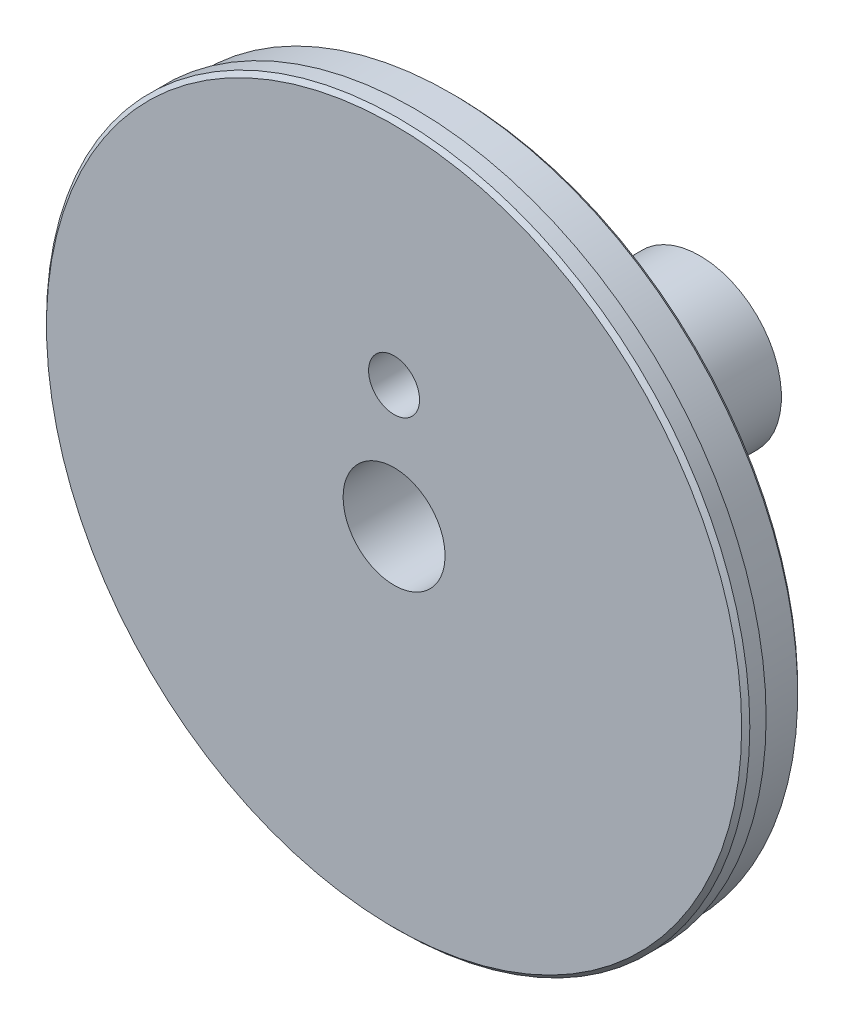
ISO-10303-21;
HEADER;
FILE_DESCRIPTION(('STEP AP214'),'2;1');
FILE_NAME('part.step','',(''),(''),'','','');
FILE_SCHEMA(('AUTOMOTIVE_DESIGN { 1 0 10303 214 1 1 1 1 }'));
ENDSEC;
DATA;
#1=APPLICATION_CONTEXT('core data for automotive mechanical design processes');
#2=APPLICATION_PROTOCOL_DEFINITION('international standard','automotive_design',2000,#1);
#3=PRODUCT_CONTEXT('',#1,'mechanical');
#4=PRODUCT('Part','Part','',(#3));
#5=PRODUCT_RELATED_PRODUCT_CATEGORY('part','',(#4));
#6=PRODUCT_DEFINITION_FORMATION('','',#4);
#7=PRODUCT_DEFINITION_CONTEXT('part definition',#1,'design');
#8=PRODUCT_DEFINITION('design','',#6,#7);
#9=PRODUCT_DEFINITION_SHAPE('','',#8);
#10=(LENGTH_UNIT() NAMED_UNIT(*) SI_UNIT(.MILLI.,.METRE.));
#11=(NAMED_UNIT(*) PLANE_ANGLE_UNIT() SI_UNIT($,.RADIAN.));
#12=(NAMED_UNIT(*) SI_UNIT($,.STERADIAN.) SOLID_ANGLE_UNIT());
#13=UNCERTAINTY_MEASURE_WITH_UNIT(LENGTH_MEASURE(1.E-05),#10,'distance_accuracy_value','');
#14=(GEOMETRIC_REPRESENTATION_CONTEXT(3) GLOBAL_UNCERTAINTY_ASSIGNED_CONTEXT((#13)) GLOBAL_UNIT_ASSIGNED_CONTEXT((#10,
#11,#12)) REPRESENTATION_CONTEXT('',''));
#15=CARTESIAN_POINT('',(0.,0.,0.));
#16=DIRECTION('',(0.,0.,1.));
#17=DIRECTION('',(1.,0.,0.));
#18=AXIS2_PLACEMENT_3D('',#15,#16,#17);
#19=CARTESIAN_POINT('',(0.,0.,1.));
#20=DIRECTION('',(0.,0.,-1.));
#21=DIRECTION('',(-1.,0.,0.));
#22=AXIS2_PLACEMENT_3D('',#19,#20,#21);
#23=CYLINDRICAL_SURFACE('',#22,17.25);
#24=CARTESIAN_POINT('',(0.,0.,0.800000000000005));
#25=DIRECTION('',(0.,0.,1.));
#26=DIRECTION('',(1.,0.,0.));
#27=AXIS2_PLACEMENT_3D('',#24,#25,#26);
#28=CIRCLE('',#27,17.25);
#29=CARTESIAN_POINT('',(17.25,0.,0.800000000000005));
#30=VERTEX_POINT('',#29);
#31=EDGE_CURVE('E10',#30,#30,#28,.F.);
#32=ORIENTED_EDGE('',*,*,#31,.T.);
#33=EDGE_LOOP('',(#32));
#34=FACE_BOUND('',#33,.T.);
#35=CARTESIAN_POINT('',(0.,0.,0.));
#36=DIRECTION('',(0.,0.,1.));
#37=DIRECTION('',(1.,0.,0.));
#38=AXIS2_PLACEMENT_3D('',#35,#36,#37);
#39=CIRCLE('',#38,17.25);
#40=CARTESIAN_POINT('',(17.25,0.,0.));
#41=VERTEX_POINT('',#40);
#42=EDGE_CURVE('E67',#41,#41,#39,.T.);
#43=ORIENTED_EDGE('',*,*,#42,.T.);
#44=EDGE_LOOP('',(#43));
#45=FACE_BOUND('',#44,.T.);
#46=ADVANCED_FACE('F33',(#34,#45),#23,.T.);
#47=CARTESIAN_POINT('',(0.,0.,1.));
#48=DIRECTION('',(0.,0.,1.));
#49=DIRECTION('',(1.,0.,0.));
#50=AXIS2_PLACEMENT_3D('',#47,#48,#49);
#51=PLANE('',#50);
#52=CARTESIAN_POINT('',(0.,0.,1.));
#53=DIRECTION('',(0.,0.,1.));
#54=DIRECTION('',(1.,0.,0.));
#55=AXIS2_PLACEMENT_3D('',#52,#53,#54);
#56=CIRCLE('',#55,17.05);
#57=CARTESIAN_POINT('',(17.05,0.,1.));
#58=VERTEX_POINT('',#57);
#59=EDGE_CURVE('E41',#58,#58,#56,.T.);
#60=ORIENTED_EDGE('',*,*,#59,.T.);
#61=EDGE_LOOP('',(#60));
#62=FACE_BOUND('',#61,.T.);
#63=CARTESIAN_POINT('',(0.,6.,1.));
#64=DIRECTION('',(0.,0.,-1.));
#65=DIRECTION('',(-1.,0.,0.));
#66=AXIS2_PLACEMENT_3D('',#63,#64,#65);
#67=CIRCLE('',#66,1.25);
#68=CARTESIAN_POINT('',(-1.25,6.,1.));
#69=VERTEX_POINT('',#68);
#70=EDGE_CURVE('E84',#69,#69,#67,.T.);
#71=ORIENTED_EDGE('',*,*,#70,.T.);
#72=EDGE_LOOP('',(#71));
#73=FACE_BOUND('',#72,.T.);
#74=CARTESIAN_POINT('',(0.,0.,1.));
#75=DIRECTION('',(0.,0.,-1.));
#76=DIRECTION('',(-1.,0.,0.));
#77=AXIS2_PLACEMENT_3D('',#74,#75,#76);
#78=CIRCLE('',#77,2.5);
#79=CARTESIAN_POINT('',(-2.5,0.,1.));
#80=VERTEX_POINT('',#79);
#81=EDGE_CURVE('E81',#80,#80,#78,.T.);
#82=ORIENTED_EDGE('',*,*,#81,.T.);
#83=EDGE_LOOP('',(#82));
#84=FACE_BOUND('',#83,.T.);
#85=ADVANCED_FACE('F91',(#62,#73,#84),#51,.T.);
#86=CARTESIAN_POINT('',(0.,0.,0.));
#87=DIRECTION('',(0.,0.,1.));
#88=DIRECTION('',(1.,0.,0.));
#89=AXIS2_PLACEMENT_3D('',#86,#87,#88);
#90=PLANE('',#89);
#91=CARTESIAN_POINT('',(0.,0.,0.));
#92=DIRECTION('',(0.,0.,-1.));
#93=DIRECTION('',(-1.,0.,0.));
#94=AXIS2_PLACEMENT_3D('',#91,#92,#93);
#95=CIRCLE('',#94,17.);
#96=CARTESIAN_POINT('',(-17.,0.,0.));
#97=VERTEX_POINT('',#96);
#98=EDGE_CURVE('E70',#97,#97,#95,.T.);
#99=ORIENTED_EDGE('',*,*,#98,.F.);
#100=EDGE_LOOP('',(#99));
#101=FACE_BOUND('',#100,.T.);
#102=ORIENTED_EDGE('',*,*,#42,.F.);
#103=EDGE_LOOP('',(#102));
#104=FACE_BOUND('',#103,.T.);
#105=ADVANCED_FACE('F126',(#101,#104),#90,.F.);
#106=CARTESIAN_POINT('',(0.,0.,-2.));
#107=DIRECTION('',(0.,0.,1.));
#108=DIRECTION('',(1.,0.,0.));
#109=AXIS2_PLACEMENT_3D('',#106,#107,#108);
#110=CYLINDRICAL_SURFACE('',#109,17.);
#111=CARTESIAN_POINT('',(0.,0.,-1.8));
#112=DIRECTION('',(0.,0.,-1.));
#113=DIRECTION('',(-1.,0.,0.));
#114=AXIS2_PLACEMENT_3D('',#111,#112,#113);
#115=CIRCLE('',#114,17.);
#116=CARTESIAN_POINT('',(-17.,0.,-1.8));
#117=VERTEX_POINT('',#116);
#118=EDGE_CURVE('E45',#117,#117,#115,.F.);
#119=ORIENTED_EDGE('',*,*,#118,.T.);
#120=EDGE_LOOP('',(#119));
#121=FACE_BOUND('',#120,.T.);
#122=ORIENTED_EDGE('',*,*,#98,.T.);
#123=EDGE_LOOP('',(#122));
#124=FACE_BOUND('',#123,.T.);
#125=ADVANCED_FACE('F160',(#121,#124),#110,.T.);
#126=CARTESIAN_POINT('',(0.,0.,-2.));
#127=DIRECTION('',(0.,0.,-1.));
#128=DIRECTION('',(-1.,0.,0.));
#129=AXIS2_PLACEMENT_3D('',#126,#127,#128);
#130=PLANE('',#129);
#131=CARTESIAN_POINT('',(0.,0.,-2.));
#132=DIRECTION('',(0.,0.,-1.));
#133=DIRECTION('',(-1.,0.,0.));
#134=AXIS2_PLACEMENT_3D('',#131,#132,#133);
#135=CIRCLE('',#134,16.8);
#136=CARTESIAN_POINT('',(-16.8,0.,-2.));
#137=VERTEX_POINT('',#136);
#138=EDGE_CURVE('E49',#137,#137,#135,.T.);
#139=ORIENTED_EDGE('',*,*,#138,.T.);
#140=EDGE_LOOP('',(#139));
#141=FACE_BOUND('',#140,.T.);
#142=CARTESIAN_POINT('',(0.,0.,-2.));
#143=DIRECTION('',(0.,0.,-1.));
#144=DIRECTION('',(-1.,0.,0.));
#145=AXIS2_PLACEMENT_3D('',#142,#143,#144);
#146=CIRCLE('',#145,9.);
#147=CARTESIAN_POINT('',(-9.,0.,-2.));
#148=VERTEX_POINT('',#147);
#149=EDGE_CURVE('E74',#148,#148,#146,.T.);
#150=ORIENTED_EDGE('',*,*,#149,.F.);
#151=EDGE_LOOP('',(#150));
#152=FACE_BOUND('',#151,.T.);
#153=ADVANCED_FACE('F157',(#141,#152),#130,.T.);
#154=CARTESIAN_POINT('',(0.,0.,-5.));
#155=DIRECTION('',(0.,0.,1.));
#156=DIRECTION('',(1.,0.,0.));
#157=AXIS2_PLACEMENT_3D('',#154,#155,#156);
#158=CYLINDRICAL_SURFACE('',#157,9.);
#159=CARTESIAN_POINT('',(0.,0.,-4.79999999999999));
#160=DIRECTION('',(0.,0.,-1.));
#161=DIRECTION('',(-1.,0.,0.));
#162=AXIS2_PLACEMENT_3D('',#159,#160,#161);
#163=CIRCLE('',#162,9.);
#164=CARTESIAN_POINT('',(-9.,0.,-4.79999999999999));
#165=VERTEX_POINT('',#164);
#166=EDGE_CURVE('E54',#165,#165,#163,.F.);
#167=ORIENTED_EDGE('',*,*,#166,.T.);
#168=EDGE_LOOP('',(#167));
#169=FACE_BOUND('',#168,.T.);
#170=ORIENTED_EDGE('',*,*,#149,.T.);
#171=EDGE_LOOP('',(#170));
#172=FACE_BOUND('',#171,.T.);
#173=ADVANCED_FACE('F106',(#169,#172),#158,.T.);
#174=CARTESIAN_POINT('',(0.,0.,-5.));
#175=DIRECTION('',(0.,0.,-1.));
#176=DIRECTION('',(-1.,0.,0.));
#177=AXIS2_PLACEMENT_3D('',#174,#175,#176);
#178=PLANE('',#177);
#179=CARTESIAN_POINT('',(0.,0.,-5.));
#180=DIRECTION('',(0.,0.,-1.));
#181=DIRECTION('',(-1.,0.,0.));
#182=AXIS2_PLACEMENT_3D('',#179,#180,#181);
#183=CIRCLE('',#182,8.8);
#184=CARTESIAN_POINT('',(-8.8,0.,-5.));
#185=VERTEX_POINT('',#184);
#186=EDGE_CURVE('E57',#185,#185,#183,.T.);
#187=ORIENTED_EDGE('',*,*,#186,.T.);
#188=EDGE_LOOP('',(#187));
#189=FACE_BOUND('',#188,.T.);
#190=CARTESIAN_POINT('',(0.,6.,-5.));
#191=DIRECTION('',(0.,0.,-1.));
#192=DIRECTION('',(-1.,0.,0.));
#193=AXIS2_PLACEMENT_3D('',#190,#191,#192);
#194=CIRCLE('',#193,1.25);
#195=CARTESIAN_POINT('',(-1.25,6.,-5.));
#196=VERTEX_POINT('',#195);
#197=EDGE_CURVE('E85',#196,#196,#194,.T.);
#198=ORIENTED_EDGE('',*,*,#197,.F.);
#199=EDGE_LOOP('',(#198));
#200=FACE_BOUND('',#199,.T.);
#201=CARTESIAN_POINT('',(0.,0.,-5.));
#202=DIRECTION('',(0.,0.,-1.));
#203=DIRECTION('',(-1.,0.,0.));
#204=AXIS2_PLACEMENT_3D('',#201,#202,#203);
#205=CIRCLE('',#204,4.);
#206=CARTESIAN_POINT('',(-4.,0.,-5.));
#207=VERTEX_POINT('',#206);
#208=EDGE_CURVE('E66',#207,#207,#205,.T.);
#209=ORIENTED_EDGE('',*,*,#208,.F.);
#210=EDGE_LOOP('',(#209));
#211=FACE_BOUND('',#210,.T.);
#212=ADVANCED_FACE('F102',(#189,#200,#211),#178,.T.);
#213=CARTESIAN_POINT('',(0.,0.,-14.));
#214=DIRECTION('',(0.,0.,1.));
#215=DIRECTION('',(1.,0.,0.));
#216=AXIS2_PLACEMENT_3D('',#213,#214,#215);
#217=CYLINDRICAL_SURFACE('',#216,4.);
#218=CARTESIAN_POINT('',(0.,0.,-14.));
#219=DIRECTION('',(0.,0.,-1.));
#220=DIRECTION('',(-1.,0.,0.));
#221=AXIS2_PLACEMENT_3D('',#218,#219,#220);
#222=CIRCLE('',#221,4.);
#223=CARTESIAN_POINT('',(-4.,0.,-14.));
#224=VERTEX_POINT('',#223);
#225=EDGE_CURVE('E71',#224,#224,#222,.T.);
#226=ORIENTED_EDGE('',*,*,#225,.F.);
#227=EDGE_LOOP('',(#226));
#228=FACE_BOUND('',#227,.T.);
#229=ORIENTED_EDGE('',*,*,#208,.T.);
#230=EDGE_LOOP('',(#229));
#231=FACE_BOUND('',#230,.T.);
#232=ADVANCED_FACE('F105',(#228,#231),#217,.T.);
#233=CARTESIAN_POINT('',(0.,0.,-14.));
#234=DIRECTION('',(0.,0.,-1.));
#235=DIRECTION('',(-1.,0.,0.));
#236=AXIS2_PLACEMENT_3D('',#233,#234,#235);
#237=PLANE('',#236);
#238=CARTESIAN_POINT('',(0.,0.,-14.));
#239=DIRECTION('',(0.,0.,-1.));
#240=DIRECTION('',(-1.,0.,0.));
#241=AXIS2_PLACEMENT_3D('',#238,#239,#240);
#242=CIRCLE('',#241,2.69999999999999);
#243=CARTESIAN_POINT('',(-2.69999999999999,0.,-14.));
#244=VERTEX_POINT('',#243);
#245=EDGE_CURVE('E60',#244,#244,#242,.F.);
#246=ORIENTED_EDGE('',*,*,#245,.T.);
#247=EDGE_LOOP('',(#246));
#248=FACE_BOUND('',#247,.T.);
#249=ORIENTED_EDGE('',*,*,#225,.T.);
#250=EDGE_LOOP('',(#249));
#251=FACE_BOUND('',#250,.T.);
#252=ADVANCED_FACE('F112',(#248,#251),#237,.T.);
#253=CARTESIAN_POINT('',(0.,0.,1.));
#254=DIRECTION('',(0.,0.,-1.));
#255=DIRECTION('',(-1.,0.,0.));
#256=AXIS2_PLACEMENT_3D('',#253,#254,#255);
#257=CYLINDRICAL_SURFACE('',#256,2.5);
#258=CARTESIAN_POINT('',(0.,0.,-13.8));
#259=DIRECTION('',(0.,0.,-1.));
#260=DIRECTION('',(-1.,0.,0.));
#261=AXIS2_PLACEMENT_3D('',#258,#259,#260);
#262=CIRCLE('',#261,2.5);
#263=CARTESIAN_POINT('',(-2.5,0.,-13.8));
#264=VERTEX_POINT('',#263);
#265=EDGE_CURVE('E63',#264,#264,#262,.T.);
#266=ORIENTED_EDGE('',*,*,#265,.T.);
#267=EDGE_LOOP('',(#266));
#268=FACE_BOUND('',#267,.T.);
#269=ORIENTED_EDGE('',*,*,#81,.F.);
#270=EDGE_LOOP('',(#269));
#271=FACE_BOUND('',#270,.T.);
#272=ADVANCED_FACE('F98',(#268,#271),#257,.F.);
#273=CARTESIAN_POINT('',(0.,6.,1.));
#274=DIRECTION('',(0.,0.,-1.));
#275=DIRECTION('',(-1.,0.,0.));
#276=AXIS2_PLACEMENT_3D('',#273,#274,#275);
#277=CYLINDRICAL_SURFACE('',#276,1.25);
#278=CARTESIAN_POINT('',(-1.25,6.,1.));
#279=CARTESIAN_POINT('',(-1.25,6.,0.937500000000001));
#280=CARTESIAN_POINT('',(-1.25,6.,0.875000000000001));
#281=CARTESIAN_POINT('',(-1.25,6.,0.750000000000001));
#282=CARTESIAN_POINT('',(-1.25,6.,0.687500000000001));
#283=CARTESIAN_POINT('',(-1.25,6.,0.562500000000001));
#284=CARTESIAN_POINT('',(-1.25,6.,0.500000000000001));
#285=CARTESIAN_POINT('',(-1.25,6.,0.375000000000001));
#286=CARTESIAN_POINT('',(-1.25,6.,0.312500000000001));
#287=CARTESIAN_POINT('',(-1.25,6.,0.187500000000001));
#288=CARTESIAN_POINT('',(-1.25,6.,0.125000000000001));
#289=CARTESIAN_POINT('',(-1.25,6.,0.));
#290=CARTESIAN_POINT('',(-1.25,6.,-0.0624999999999992));
#291=CARTESIAN_POINT('',(-1.25,6.,-0.187499999999999));
#292=CARTESIAN_POINT('',(-1.25,6.,-0.249999999999999));
#293=CARTESIAN_POINT('',(-1.25,6.,-0.374999999999999));
#294=CARTESIAN_POINT('',(-1.25,6.,-0.437499999999999));
#295=CARTESIAN_POINT('',(-1.25,6.,-0.562499999999999));
#296=CARTESIAN_POINT('',(-1.25,6.,-0.624999999999999));
#297=CARTESIAN_POINT('',(-1.25,6.,-0.749999999999999));
#298=CARTESIAN_POINT('',(-1.25,6.,-0.8125));
#299=CARTESIAN_POINT('',(-1.25,6.,-0.937499999999999));
#300=CARTESIAN_POINT('',(-1.25,6.,-0.999999999999999));
#301=CARTESIAN_POINT('',(-1.25,6.,-1.125));
#302=CARTESIAN_POINT('',(-1.25,6.,-1.1875));
#303=CARTESIAN_POINT('',(-1.25,6.,-1.3125));
#304=CARTESIAN_POINT('',(-1.25,6.,-1.375));
#305=CARTESIAN_POINT('',(-1.25,6.,-1.5));
#306=CARTESIAN_POINT('',(-1.25,6.,-1.5625));
#307=CARTESIAN_POINT('',(-1.25,6.,-1.6875));
#308=CARTESIAN_POINT('',(-1.25,6.,-1.75));
#309=CARTESIAN_POINT('',(-1.25,6.,-1.875));
#310=CARTESIAN_POINT('',(-1.25,6.,-1.9375));
#311=CARTESIAN_POINT('',(-1.25,6.,-2.0625));
#312=CARTESIAN_POINT('',(-1.25,6.,-2.125));
#313=CARTESIAN_POINT('',(-1.25,6.,-2.25));
#314=CARTESIAN_POINT('',(-1.25,6.,-2.3125));
#315=CARTESIAN_POINT('',(-1.25,6.,-2.4375));
#316=CARTESIAN_POINT('',(-1.25,6.,-2.5));
#317=CARTESIAN_POINT('',(-1.25,6.,-2.625));
#318=CARTESIAN_POINT('',(-1.25,6.,-2.6875));
#319=CARTESIAN_POINT('',(-1.25,6.,-2.8125));
#320=CARTESIAN_POINT('',(-1.25,6.,-2.875));
#321=CARTESIAN_POINT('',(-1.25,6.,-3.));
#322=CARTESIAN_POINT('',(-1.25,6.,-3.0625));
#323=CARTESIAN_POINT('',(-1.25,6.,-3.1875));
#324=CARTESIAN_POINT('',(-1.25,6.,-3.25));
#325=CARTESIAN_POINT('',(-1.25,6.,-3.375));
#326=CARTESIAN_POINT('',(-1.25,6.,-3.4375));
#327=CARTESIAN_POINT('',(-1.25,6.,-3.5625));
#328=CARTESIAN_POINT('',(-1.25,6.,-3.625));
#329=CARTESIAN_POINT('',(-1.25,6.,-3.75));
#330=CARTESIAN_POINT('',(-1.25,6.,-3.8125));
#331=CARTESIAN_POINT('',(-1.25,6.,-3.9375));
#332=CARTESIAN_POINT('',(-1.25,6.,-4.));
#333=CARTESIAN_POINT('',(-1.25,6.,-4.125));
#334=CARTESIAN_POINT('',(-1.25,6.,-4.1875));
#335=CARTESIAN_POINT('',(-1.25,6.,-4.3125));
#336=CARTESIAN_POINT('',(-1.25,6.,-4.375));
#337=CARTESIAN_POINT('',(-1.25,6.,-4.5));
#338=CARTESIAN_POINT('',(-1.25,6.,-4.5625));
#339=CARTESIAN_POINT('',(-1.25,6.,-4.6875));
#340=CARTESIAN_POINT('',(-1.25,6.,-4.75));
#341=CARTESIAN_POINT('',(-1.25,6.,-4.875));
#342=CARTESIAN_POINT('',(-1.25,6.,-4.9375));
#343=CARTESIAN_POINT('',(-1.25,6.,-5.));
#344=B_SPLINE_CURVE_WITH_KNOTS('',3,(#278,#279,#280,#281,#282,#283,#284,#285,#286,#287,#288,
#289,#290,#291,#292,#293,#294,#295,#296,#297,#298,#299,#300,#301,#302,#303,#304,#305,#306,#307,
#308,#309,#310,#311,#312,#313,#314,#315,#316,#317,#318,#319,#320,#321,#322,#323,#324,#325,#326,
#327,#328,#329,#330,#331,#332,#333,#334,#335,#336,#337,#338,#339,#340,#341,#342,#343),
.UNSPECIFIED.,.F.,.F.,(4,2,2,2,2,2,2,2,2,2,2,2,2,2,2,2,2,2,2,2,2,2,2,2,2,2,2,2,2,2,2,2,4),(0.,
0.1875,0.375,0.5625,0.75,0.9375,1.125,1.3125,1.5,1.6875,1.875,2.0625,2.25,2.4375,2.625,2.8125,
3.,3.1875,3.375,3.5625,3.75,3.9375,4.125,4.3125,4.5,4.6875,4.875,5.0625,5.25,5.4375,5.625,
5.8125,6.),.UNSPECIFIED.);
#345=EDGE_CURVE('BSEAM94',#69,#196,#344,.T.);
#346=ORIENTED_EDGE('',*,*,#70,.F.);
#347=ORIENTED_EDGE('',*,*,#197,.T.);
#348=ORIENTED_EDGE('',*,*,#345,.T.);
#349=ORIENTED_EDGE('',*,*,#345,.F.);
#350=EDGE_LOOP('',(#346,#348,#347,#349));
#351=FACE_BOUND('',#350,.T.);
#352=ADVANCED_FACE('F94',(#351),#277,.F.);
#353=CARTESIAN_POINT('',(0.,0.,-13.8));
#354=DIRECTION('',(0.,0.,-1.));
#355=DIRECTION('',(-1.,0.,0.));
#356=AXIS2_PLACEMENT_3D('',#353,#354,#355);
#357=CONICAL_SURFACE('',#356,2.5,0.785398163397436);
#358=ORIENTED_EDGE('',*,*,#245,.F.);
#359=EDGE_LOOP('',(#358));
#360=FACE_BOUND('',#359,.T.);
#361=ORIENTED_EDGE('',*,*,#265,.F.);
#362=EDGE_LOOP('',(#361));
#363=FACE_BOUND('',#362,.T.);
#364=ADVANCED_FACE('F97',(#360,#363),#357,.F.);
#365=CARTESIAN_POINT('',(0.,0.,-5.));
#366=DIRECTION('',(0.,0.,1.));
#367=DIRECTION('',(1.,0.,0.));
#368=AXIS2_PLACEMENT_3D('',#365,#366,#367);
#369=CONICAL_SURFACE('',#368,8.8,0.78539816339744);
#370=ORIENTED_EDGE('',*,*,#166,.F.);
#371=EDGE_LOOP('',(#370));
#372=FACE_BOUND('',#371,.T.);
#373=ORIENTED_EDGE('',*,*,#186,.F.);
#374=EDGE_LOOP('',(#373));
#375=FACE_BOUND('',#374,.T.);
#376=ADVANCED_FACE('F137',(#372,#375),#369,.T.);
#377=CARTESIAN_POINT('',(0.,0.,-2.));
#378=DIRECTION('',(0.,0.,1.));
#379=DIRECTION('',(1.,0.,0.));
#380=AXIS2_PLACEMENT_3D('',#377,#378,#379);
#381=CONICAL_SURFACE('',#380,16.8,0.78539816339744);
#382=ORIENTED_EDGE('',*,*,#118,.F.);
#383=EDGE_LOOP('',(#382));
#384=FACE_BOUND('',#383,.T.);
#385=ORIENTED_EDGE('',*,*,#138,.F.);
#386=EDGE_LOOP('',(#385));
#387=FACE_BOUND('',#386,.T.);
#388=ADVANCED_FACE('F143',(#384,#387),#381,.T.);
#389=CARTESIAN_POINT('',(0.,0.,1.));
#390=DIRECTION('',(0.,0.,-1.));
#391=DIRECTION('',(-1.,0.,0.));
#392=AXIS2_PLACEMENT_3D('',#389,#390,#391);
#393=CONICAL_SURFACE('',#392,17.05,0.785398163397466);
#394=ORIENTED_EDGE('',*,*,#31,.F.);
#395=EDGE_LOOP('',(#394));
#396=FACE_BOUND('',#395,.T.);
#397=ORIENTED_EDGE('',*,*,#59,.F.);
#398=EDGE_LOOP('',(#397));
#399=FACE_BOUND('',#398,.T.);
#400=ADVANCED_FACE('F36',(#396,#399),#393,.T.);
#401=CLOSED_SHELL('',(#46,#85,#105,#125,#153,#173,#212,#232,#252,#272,#352,#364,#376,#388,#400));
#402=MANIFOLD_SOLID_BREP('B2',#401);
#403=ADVANCED_BREP_SHAPE_REPRESENTATION('',(#18,#402),#14);
#404=SHAPE_DEFINITION_REPRESENTATION(#9,#403);
ENDSEC;
END-ISO-10303-21;
